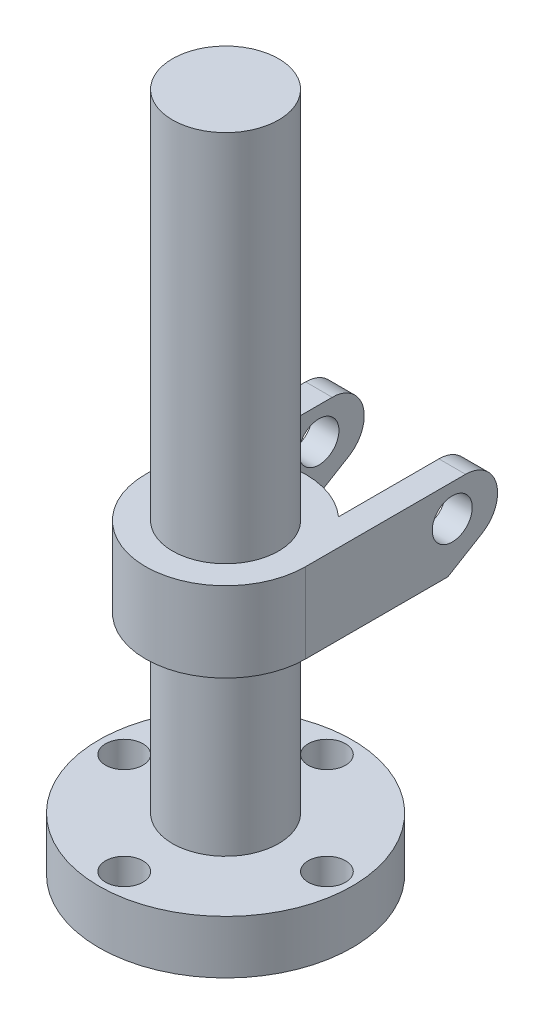
ISO-10303-21;
HEADER;
FILE_DESCRIPTION(('STEP AP214'),'2;1');
FILE_NAME('part.step','',(''),(''),'','','');
FILE_SCHEMA(('AUTOMOTIVE_DESIGN { 1 0 10303 214 1 1 1 1 }'));
ENDSEC;
DATA;
#1=APPLICATION_CONTEXT('core data for automotive mechanical design processes');
#2=APPLICATION_PROTOCOL_DEFINITION('international standard','automotive_design',2000,#1);
#3=PRODUCT_CONTEXT('',#1,'mechanical');
#4=PRODUCT('Part','Part','',(#3));
#5=PRODUCT_RELATED_PRODUCT_CATEGORY('part','',(#4));
#6=PRODUCT_DEFINITION_FORMATION('','',#4);
#7=PRODUCT_DEFINITION_CONTEXT('part definition',#1,'design');
#8=PRODUCT_DEFINITION('design','',#6,#7);
#9=PRODUCT_DEFINITION_SHAPE('','',#8);
#10=(LENGTH_UNIT() NAMED_UNIT(*) SI_UNIT(.MILLI.,.METRE.));
#11=(NAMED_UNIT(*) PLANE_ANGLE_UNIT() SI_UNIT($,.RADIAN.));
#12=(NAMED_UNIT(*) SI_UNIT($,.STERADIAN.) SOLID_ANGLE_UNIT());
#13=UNCERTAINTY_MEASURE_WITH_UNIT(LENGTH_MEASURE(1.E-05),#10,'distance_accuracy_value','');
#14=(GEOMETRIC_REPRESENTATION_CONTEXT(3) GLOBAL_UNCERTAINTY_ASSIGNED_CONTEXT((#13)) GLOBAL_UNIT_ASSIGNED_CONTEXT((#10,
#11,#12)) REPRESENTATION_CONTEXT('',''));
#15=CARTESIAN_POINT('',(0.,0.,0.));
#16=DIRECTION('',(0.,0.,1.));
#17=DIRECTION('',(1.,0.,0.));
#18=AXIS2_PLACEMENT_3D('',#15,#16,#17);
#19=CARTESIAN_POINT('',(0.,115.,0.));
#20=DIRECTION('',(0.,-1.,0.));
#21=DIRECTION('',(0.,0.,-1.));
#22=AXIS2_PLACEMENT_3D('',#19,#20,#21);
#23=CYLINDRICAL_SURFACE('',#22,30.);
#24=DIRECTION('',(0.,-1.,0.));
#25=VECTOR('',#24,1.);
#26=CARTESIAN_POINT('',(-20.,115.,-22.3606797749979));
#27=LINE('',#26,#25);
#28=CARTESIAN_POINT('',(-20.,115.,-22.3606797749979));
#29=VERTEX_POINT('',#28);
#30=CARTESIAN_POINT('',(-20.,85.,-22.3606797749979));
#31=VERTEX_POINT('',#30);
#32=EDGE_CURVE('E160',#29,#31,#27,.T.);
#33=ORIENTED_EDGE('',*,*,#32,.F.);
#34=CARTESIAN_POINT('',(0.,115.,0.));
#35=DIRECTION('',(0.,1.,0.));
#36=DIRECTION('',(0.,0.,1.));
#37=AXIS2_PLACEMENT_3D('',#34,#35,#36);
#38=CIRCLE('',#37,30.);
#39=CARTESIAN_POINT('',(20.,115.,-22.3606797749979));
#40=VERTEX_POINT('',#39);
#41=EDGE_CURVE('E70',#40,#29,#38,.T.);
#42=ORIENTED_EDGE('',*,*,#41,.F.);
#43=DIRECTION('',(0.,-1.,0.));
#44=VECTOR('',#43,1.);
#45=CARTESIAN_POINT('',(20.,115.,-22.3606797749979));
#46=LINE('',#45,#44);
#47=CARTESIAN_POINT('',(20.,85.,-22.3606797749979));
#48=VERTEX_POINT('',#47);
#49=EDGE_CURVE('E210',#48,#40,#46,.F.);
#50=ORIENTED_EDGE('',*,*,#49,.F.);
#51=CARTESIAN_POINT('',(0.,85.,0.));
#52=DIRECTION('',(0.,1.,0.));
#53=DIRECTION('',(0.,0.,1.));
#54=AXIS2_PLACEMENT_3D('',#51,#52,#53);
#55=CIRCLE('',#54,30.);
#56=EDGE_CURVE('E227',#48,#31,#55,.T.);
#57=ORIENTED_EDGE('',*,*,#56,.T.);
#58=EDGE_LOOP('',(#33,#42,#50,#57));
#59=FACE_BOUND('',#58,.T.);
#60=ADVANCED_FACE('F44',(#59),#23,.T.);
#61=DIRECTION('',(0.,-1.,0.));
#62=VECTOR('',#61,1.);
#63=CARTESIAN_POINT('',(-30.,115.,0.));
#64=LINE('',#63,#62);
#65=CARTESIAN_POINT('',(-30.,115.,0.));
#66=VERTEX_POINT('',#65);
#67=CARTESIAN_POINT('',(-30.,85.,0.));
#68=VERTEX_POINT('',#67);
#69=EDGE_CURVE('E62',#66,#68,#64,.T.);
#70=ORIENTED_EDGE('',*,*,#69,.T.);
#71=CARTESIAN_POINT('',(30.,85.,0.));
#72=VERTEX_POINT('',#71);
#73=EDGE_CURVE('E221',#68,#72,#55,.T.);
#74=ORIENTED_EDGE('',*,*,#73,.T.);
#75=DIRECTION('',(0.,-1.,0.));
#76=VECTOR('',#75,1.);
#77=CARTESIAN_POINT('',(30.,115.,0.));
#78=LINE('',#77,#76);
#79=CARTESIAN_POINT('',(30.,115.,0.));
#80=VERTEX_POINT('',#79);
#81=EDGE_CURVE('E168',#80,#72,#78,.T.);
#82=ORIENTED_EDGE('',*,*,#81,.F.);
#83=EDGE_CURVE('E226',#66,#80,#38,.T.);
#84=ORIENTED_EDGE('',*,*,#83,.F.);
#85=EDGE_LOOP('',(#70,#74,#82,#84));
#86=FACE_BOUND('',#85,.T.);
#87=ADVANCED_FACE('F310',(#86),#23,.T.);
#88=CARTESIAN_POINT('',(0.,20.,0.));
#89=DIRECTION('',(0.,-1.,0.));
#90=DIRECTION('',(0.,0.,-1.));
#91=AXIS2_PLACEMENT_3D('',#88,#89,#90);
#92=CYLINDRICAL_SURFACE('',#91,47.5);
#93=CARTESIAN_POINT('',(0.,20.,0.));
#94=DIRECTION('',(0.,1.,0.));
#95=DIRECTION('',(0.,0.,1.));
#96=AXIS2_PLACEMENT_3D('',#93,#94,#95);
#97=CIRCLE('',#96,47.5);
#98=CARTESIAN_POINT('',(0.,20.,47.5));
#99=VERTEX_POINT('',#98);
#100=EDGE_CURVE('E238',#99,#99,#97,.T.);
#101=ORIENTED_EDGE('',*,*,#100,.F.);
#102=EDGE_LOOP('',(#101));
#103=FACE_BOUND('',#102,.T.);
#104=CARTESIAN_POINT('',(0.,0.,0.));
#105=DIRECTION('',(0.,1.,0.));
#106=DIRECTION('',(0.,0.,1.));
#107=AXIS2_PLACEMENT_3D('',#104,#105,#106);
#108=CIRCLE('',#107,47.5);
#109=CARTESIAN_POINT('',(0.,0.,47.5));
#110=VERTEX_POINT('',#109);
#111=EDGE_CURVE('E234',#110,#110,#108,.T.);
#112=ORIENTED_EDGE('',*,*,#111,.T.);
#113=EDGE_LOOP('',(#112));
#114=FACE_BOUND('',#113,.T.);
#115=ADVANCED_FACE('F46',(#103,#114),#92,.T.);
#116=CARTESIAN_POINT('',(0.,20.,0.));
#117=DIRECTION('',(0.,1.,0.));
#118=DIRECTION('',(0.,0.,1.));
#119=AXIS2_PLACEMENT_3D('',#116,#117,#118);
#120=PLANE('',#119);
#121=CARTESIAN_POINT('',(0.,20.,-38.));
#122=DIRECTION('',(0.,1.,0.));
#123=DIRECTION('',(0.,0.,1.));
#124=AXIS2_PLACEMENT_3D('',#121,#122,#123);
#125=CIRCLE('',#124,7.);
#126=CARTESIAN_POINT('',(0.,20.,-31.));
#127=VERTEX_POINT('',#126);
#128=EDGE_CURVE('E681',#127,#127,#125,.T.);
#129=ORIENTED_EDGE('',*,*,#128,.F.);
#130=EDGE_LOOP('',(#129));
#131=FACE_BOUND('',#130,.T.);
#132=CARTESIAN_POINT('',(38.,20.,1.32676290876039E-13));
#133=DIRECTION('',(0.,1.,0.));
#134=DIRECTION('',(0.,0.,1.));
#135=AXIS2_PLACEMENT_3D('',#132,#133,#134);
#136=CIRCLE('',#135,7.);
#137=CARTESIAN_POINT('',(38.,20.,7.00000000000013));
#138=VERTEX_POINT('',#137);
#139=EDGE_CURVE('E685',#138,#138,#136,.T.);
#140=ORIENTED_EDGE('',*,*,#139,.F.);
#141=EDGE_LOOP('',(#140));
#142=FACE_BOUND('',#141,.T.);
#143=CARTESIAN_POINT('',(-2.65352581752078E-13,20.,38.));
#144=DIRECTION('',(0.,1.,0.));
#145=DIRECTION('',(0.,0.,1.));
#146=AXIS2_PLACEMENT_3D('',#143,#144,#145);
#147=CIRCLE('',#146,7.);
#148=CARTESIAN_POINT('',(-2.65352581752078E-13,20.,45.));
#149=VERTEX_POINT('',#148);
#150=EDGE_CURVE('E693',#149,#149,#147,.T.);
#151=ORIENTED_EDGE('',*,*,#150,.F.);
#152=EDGE_LOOP('',(#151));
#153=FACE_BOUND('',#152,.T.);
#154=CARTESIAN_POINT('',(-38.,20.,-3.98028872628117E-13));
#155=DIRECTION('',(0.,1.,0.));
#156=DIRECTION('',(0.,0.,1.));
#157=AXIS2_PLACEMENT_3D('',#154,#155,#156);
#158=CIRCLE('',#157,7.);
#159=CARTESIAN_POINT('',(-38.,20.,6.9999999999996));
#160=VERTEX_POINT('',#159);
#161=EDGE_CURVE('E265',#160,#160,#158,.T.);
#162=ORIENTED_EDGE('',*,*,#161,.F.);
#163=EDGE_LOOP('',(#162));
#164=FACE_BOUND('',#163,.T.);
#165=CARTESIAN_POINT('',(0.,20.,0.));
#166=DIRECTION('',(0.,1.,0.));
#167=DIRECTION('',(0.,0.,1.));
#168=AXIS2_PLACEMENT_3D('',#165,#166,#167);
#169=CIRCLE('',#168,19.9);
#170=CARTESIAN_POINT('',(0.,20.,19.9));
#171=VERTEX_POINT('',#170);
#172=EDGE_CURVE('E54',#171,#171,#169,.T.);
#173=ORIENTED_EDGE('',*,*,#172,.F.);
#174=EDGE_LOOP('',(#173));
#175=FACE_BOUND('',#174,.T.);
#176=ORIENTED_EDGE('',*,*,#100,.T.);
#177=EDGE_LOOP('',(#176));
#178=FACE_BOUND('',#177,.T.);
#179=ADVANCED_FACE('F357',(#131,#142,#153,#164,#175,#178),#120,.T.);
#180=CARTESIAN_POINT('',(0.,0.,0.));
#181=DIRECTION('',(0.,1.,0.));
#182=DIRECTION('',(0.,0.,1.));
#183=AXIS2_PLACEMENT_3D('',#180,#181,#182);
#184=PLANE('',#183);
#185=CARTESIAN_POINT('',(0.,0.,0.));
#186=DIRECTION('',(0.,-1.,0.));
#187=DIRECTION('',(0.,0.,-1.));
#188=AXIS2_PLACEMENT_3D('',#185,#186,#187);
#189=CIRCLE('',#188,20.);
#190=CARTESIAN_POINT('',(0.,0.,-20.));
#191=VERTEX_POINT('',#190);
#192=EDGE_CURVE('E369',#191,#191,#189,.T.);
#193=ORIENTED_EDGE('',*,*,#192,.F.);
#194=EDGE_LOOP('',(#193));
#195=FACE_BOUND('',#194,.T.);
#196=CARTESIAN_POINT('',(0.,0.,38.));
#197=DIRECTION('',(0.,-1.,0.));
#198=DIRECTION('',(0.,0.,-1.));
#199=AXIS2_PLACEMENT_3D('',#196,#197,#198);
#200=CIRCLE('',#199,5.);
#201=CARTESIAN_POINT('',(0.,0.,33.));
#202=VERTEX_POINT('',#201);
#203=EDGE_CURVE('E250',#202,#202,#200,.T.);
#204=ORIENTED_EDGE('',*,*,#203,.F.);
#205=EDGE_LOOP('',(#204));
#206=FACE_BOUND('',#205,.T.);
#207=CARTESIAN_POINT('',(38.,0.,-1.32676290876039E-13));
#208=DIRECTION('',(0.,-1.,0.));
#209=DIRECTION('',(0.,0.,-1.));
#210=AXIS2_PLACEMENT_3D('',#207,#208,#209);
#211=CIRCLE('',#210,5.);
#212=CARTESIAN_POINT('',(38.,0.,-5.00000000000013));
#213=VERTEX_POINT('',#212);
#214=EDGE_CURVE('E376',#213,#213,#211,.T.);
#215=ORIENTED_EDGE('',*,*,#214,.F.);
#216=EDGE_LOOP('',(#215));
#217=FACE_BOUND('',#216,.T.);
#218=CARTESIAN_POINT('',(-2.65352581752078E-13,0.,-38.));
#219=DIRECTION('',(0.,-1.,0.));
#220=DIRECTION('',(0.,0.,-1.));
#221=AXIS2_PLACEMENT_3D('',#218,#219,#220);
#222=CIRCLE('',#221,5.);
#223=CARTESIAN_POINT('',(-2.65352581752078E-13,0.,-43.));
#224=VERTEX_POINT('',#223);
#225=EDGE_CURVE('E380',#224,#224,#222,.T.);
#226=ORIENTED_EDGE('',*,*,#225,.F.);
#227=EDGE_LOOP('',(#226));
#228=FACE_BOUND('',#227,.T.);
#229=CARTESIAN_POINT('',(-38.,0.,3.98028872628117E-13));
#230=DIRECTION('',(0.,-1.,0.));
#231=DIRECTION('',(0.,0.,-1.));
#232=AXIS2_PLACEMENT_3D('',#229,#230,#231);
#233=CIRCLE('',#232,5.);
#234=CARTESIAN_POINT('',(-38.,0.,-4.9999999999996));
#235=VERTEX_POINT('',#234);
#236=EDGE_CURVE('E384',#235,#235,#233,.T.);
#237=ORIENTED_EDGE('',*,*,#236,.F.);
#238=EDGE_LOOP('',(#237));
#239=FACE_BOUND('',#238,.T.);
#240=ORIENTED_EDGE('',*,*,#111,.F.);
#241=EDGE_LOOP('',(#240));
#242=FACE_BOUND('',#241,.T.);
#243=ADVANCED_FACE('F355',(#195,#206,#217,#228,#239,#242),#184,.F.);
#244=CARTESIAN_POINT('',(0.,85.,0.));
#245=DIRECTION('',(0.,-1.,0.));
#246=DIRECTION('',(0.,0.,-1.));
#247=AXIS2_PLACEMENT_3D('',#244,#245,#246);
#248=CYLINDRICAL_SURFACE('',#247,19.9);
#249=CARTESIAN_POINT('',(0.,85.,0.));
#250=DIRECTION('',(0.,1.,0.));
#251=DIRECTION('',(0.,0.,1.));
#252=AXIS2_PLACEMENT_3D('',#249,#250,#251);
#253=CIRCLE('',#252,19.9);
#254=CARTESIAN_POINT('',(0.,85.,19.9));
#255=VERTEX_POINT('',#254);
#256=EDGE_CURVE('E225',#255,#255,#253,.T.);
#257=ORIENTED_EDGE('',*,*,#256,.F.);
#258=EDGE_LOOP('',(#257));
#259=FACE_BOUND('',#258,.T.);
#260=ORIENTED_EDGE('',*,*,#172,.T.);
#261=EDGE_LOOP('',(#260));
#262=FACE_BOUND('',#261,.T.);
#263=ADVANCED_FACE('F352',(#259,#262),#248,.T.);
#264=CARTESIAN_POINT('',(0.,115.,0.));
#265=DIRECTION('',(0.,1.,0.));
#266=DIRECTION('',(0.,0.,1.));
#267=AXIS2_PLACEMENT_3D('',#264,#265,#266);
#268=PLANE('',#267);
#269=ORIENTED_EDGE('',*,*,#41,.T.);
#270=DIRECTION('',(0.,0.,1.));
#271=VECTOR('',#270,1.);
#272=CARTESIAN_POINT('',(-20.,115.,0.));
#273=LINE('',#272,#271);
#274=CARTESIAN_POINT('',(-20.,115.,-60.));
#275=VERTEX_POINT('',#274);
#276=EDGE_CURVE('E125',#275,#29,#273,.T.);
#277=ORIENTED_EDGE('',*,*,#276,.F.);
#278=DIRECTION('',(-1.,0.,0.));
#279=VECTOR('',#278,1.);
#280=CARTESIAN_POINT('',(-20.,115.,-60.));
#281=LINE('',#280,#279);
#282=CARTESIAN_POINT('',(-30.,115.,-60.));
#283=VERTEX_POINT('',#282);
#284=EDGE_CURVE('E130',#275,#283,#281,.T.);
#285=ORIENTED_EDGE('',*,*,#284,.T.);
#286=DIRECTION('',(0.,0.,1.));
#287=VECTOR('',#286,1.);
#288=CARTESIAN_POINT('',(-30.,115.,-55.));
#289=LINE('',#288,#287);
#290=EDGE_CURVE('E288',#283,#66,#289,.T.);
#291=ORIENTED_EDGE('',*,*,#290,.T.);
#292=ORIENTED_EDGE('',*,*,#83,.T.);
#293=DIRECTION('',(0.,0.,1.));
#294=VECTOR('',#293,1.);
#295=CARTESIAN_POINT('',(30.,115.,0.));
#296=LINE('',#295,#294);
#297=CARTESIAN_POINT('',(30.,115.,-60.));
#298=VERTEX_POINT('',#297);
#299=EDGE_CURVE('E176',#298,#80,#296,.T.);
#300=ORIENTED_EDGE('',*,*,#299,.F.);
#301=DIRECTION('',(1.,0.,0.));
#302=VECTOR('',#301,1.);
#303=CARTESIAN_POINT('',(20.,115.,-60.));
#304=LINE('',#303,#302);
#305=CARTESIAN_POINT('',(20.,115.,-60.));
#306=VERTEX_POINT('',#305);
#307=EDGE_CURVE('E206',#306,#298,#304,.T.);
#308=ORIENTED_EDGE('',*,*,#307,.F.);
#309=DIRECTION('',(0.,0.,1.));
#310=VECTOR('',#309,1.);
#311=CARTESIAN_POINT('',(20.,115.,-55.));
#312=LINE('',#311,#310);
#313=EDGE_CURVE('E184',#306,#40,#312,.T.);
#314=ORIENTED_EDGE('',*,*,#313,.T.);
#315=EDGE_LOOP('',(#269,#277,#285,#291,#292,#300,#308,#314));
#316=FACE_BOUND('',#315,.T.);
#317=CARTESIAN_POINT('',(0.,115.,0.));
#318=DIRECTION('',(0.,1.,0.));
#319=DIRECTION('',(0.,0.,1.));
#320=AXIS2_PLACEMENT_3D('',#317,#318,#319);
#321=CIRCLE('',#320,19.9);
#322=CARTESIAN_POINT('',(0.,115.,19.9));
#323=VERTEX_POINT('',#322);
#324=EDGE_CURVE('E11',#323,#323,#321,.T.);
#325=ORIENTED_EDGE('',*,*,#324,.F.);
#326=EDGE_LOOP('',(#325));
#327=FACE_BOUND('',#326,.T.);
#328=ADVANCED_FACE('F127',(#316,#327),#268,.T.);
#329=CARTESIAN_POINT('',(0.,85.,0.));
#330=DIRECTION('',(0.,1.,0.));
#331=DIRECTION('',(0.,0.,1.));
#332=AXIS2_PLACEMENT_3D('',#329,#330,#331);
#333=PLANE('',#332);
#334=ORIENTED_EDGE('',*,*,#73,.F.);
#335=DIRECTION('',(0.,0.,-1.));
#336=VECTOR('',#335,1.);
#337=CARTESIAN_POINT('',(-30.,85.,0.));
#338=LINE('',#337,#336);
#339=CARTESIAN_POINT('',(-30.,85.,-53.3422176346147));
#340=VERTEX_POINT('',#339);
#341=EDGE_CURVE('E135',#68,#340,#338,.T.);
#342=ORIENTED_EDGE('',*,*,#341,.T.);
#343=DIRECTION('',(-1.,0.,0.));
#344=VECTOR('',#343,1.);
#345=CARTESIAN_POINT('',(-20.,85.,-53.3422176346147));
#346=LINE('',#345,#344);
#347=CARTESIAN_POINT('',(-20.,85.,-53.3422176346147));
#348=VERTEX_POINT('',#347);
#349=EDGE_CURVE('E155',#348,#340,#346,.T.);
#350=ORIENTED_EDGE('',*,*,#349,.F.);
#351=DIRECTION('',(0.,0.,-1.));
#352=VECTOR('',#351,1.);
#353=CARTESIAN_POINT('',(-20.,85.,0.));
#354=LINE('',#353,#352);
#355=EDGE_CURVE('E151',#31,#348,#354,.T.);
#356=ORIENTED_EDGE('',*,*,#355,.F.);
#357=ORIENTED_EDGE('',*,*,#56,.F.);
#358=DIRECTION('',(0.,0.,-1.));
#359=VECTOR('',#358,1.);
#360=CARTESIAN_POINT('',(20.,85.,0.));
#361=LINE('',#360,#359);
#362=CARTESIAN_POINT('',(20.,85.,-53.3422176346147));
#363=VERTEX_POINT('',#362);
#364=EDGE_CURVE('E172',#48,#363,#361,.T.);
#365=ORIENTED_EDGE('',*,*,#364,.T.);
#366=DIRECTION('',(1.,0.,0.));
#367=VECTOR('',#366,1.);
#368=CARTESIAN_POINT('',(20.,85.,-53.3422176346147));
#369=LINE('',#368,#367);
#370=CARTESIAN_POINT('',(30.,85.,-53.3422176346147));
#371=VERTEX_POINT('',#370);
#372=EDGE_CURVE('E187',#363,#371,#369,.T.);
#373=ORIENTED_EDGE('',*,*,#372,.T.);
#374=DIRECTION('',(0.,0.,-1.));
#375=VECTOR('',#374,1.);
#376=CARTESIAN_POINT('',(30.,85.,0.));
#377=LINE('',#376,#375);
#378=EDGE_CURVE('E191',#72,#371,#377,.T.);
#379=ORIENTED_EDGE('',*,*,#378,.F.);
#380=EDGE_LOOP('',(#334,#342,#350,#356,#357,#365,#373,#379));
#381=FACE_BOUND('',#380,.T.);
#382=ORIENTED_EDGE('',*,*,#256,.T.);
#383=EDGE_LOOP('',(#382));
#384=FACE_BOUND('',#383,.T.);
#385=ADVANCED_FACE('F315',(#381,#384),#333,.F.);
#386=CARTESIAN_POINT('',(0.,255.,0.));
#387=DIRECTION('',(0.,-1.,0.));
#388=DIRECTION('',(0.,0.,-1.));
#389=AXIS2_PLACEMENT_3D('',#386,#387,#388);
#390=CYLINDRICAL_SURFACE('',#389,19.9);
#391=CARTESIAN_POINT('',(0.,255.,0.));
#392=DIRECTION('',(0.,1.,0.));
#393=DIRECTION('',(0.,0.,1.));
#394=AXIS2_PLACEMENT_3D('',#391,#392,#393);
#395=CIRCLE('',#394,19.9);
#396=CARTESIAN_POINT('',(0.,255.,19.9));
#397=VERTEX_POINT('',#396);
#398=EDGE_CURVE('E218',#397,#397,#395,.T.);
#399=ORIENTED_EDGE('',*,*,#398,.F.);
#400=EDGE_LOOP('',(#399));
#401=FACE_BOUND('',#400,.T.);
#402=ORIENTED_EDGE('',*,*,#324,.T.);
#403=EDGE_LOOP('',(#402));
#404=FACE_BOUND('',#403,.T.);
#405=ADVANCED_FACE('F404',(#401,#404),#390,.T.);
#406=CARTESIAN_POINT('',(0.,255.,0.));
#407=DIRECTION('',(0.,1.,0.));
#408=DIRECTION('',(0.,0.,1.));
#409=AXIS2_PLACEMENT_3D('',#406,#407,#408);
#410=PLANE('',#409);
#411=ORIENTED_EDGE('',*,*,#398,.T.);
#412=EDGE_LOOP('',(#411));
#413=FACE_BOUND('',#412,.T.);
#414=ADVANCED_FACE('F408',(#413),#410,.T.);
#415=CARTESIAN_POINT('',(20.,103.,-60.));
#416=DIRECTION('',(1.,0.,0.));
#417=DIRECTION('',(0.,0.,-1.));
#418=AXIS2_PLACEMENT_3D('',#415,#416,#417);
#419=PLANE('',#418);
#420=CARTESIAN_POINT('',(20.,103.,-55.));
#421=DIRECTION('',(1.,0.,0.));
#422=DIRECTION('',(0.,0.,-1.));
#423=AXIS2_PLACEMENT_3D('',#420,#421,#422);
#424=CIRCLE('',#423,7.5);
#425=CARTESIAN_POINT('',(20.,103.,-62.5));
#426=VERTEX_POINT('',#425);
#427=EDGE_CURVE('E164',#426,#426,#424,.T.);
#428=ORIENTED_EDGE('',*,*,#427,.T.);
#429=EDGE_LOOP('',(#428));
#430=FACE_BOUND('',#429,.T.);
#431=ORIENTED_EDGE('',*,*,#364,.F.);
#432=ORIENTED_EDGE('',*,*,#49,.T.);
#433=ORIENTED_EDGE('',*,*,#313,.F.);
#434=CARTESIAN_POINT('',(20.,103.,-60.));
#435=DIRECTION('',(1.,0.,0.));
#436=DIRECTION('',(0.,0.,-1.));
#437=AXIS2_PLACEMENT_3D('',#434,#435,#436);
#438=CIRCLE('',#437,12.);
#439=CARTESIAN_POINT('',(20.,92.7139923915746,-66.1804568989206));
#440=VERTEX_POINT('',#439);
#441=EDGE_CURVE('E180',#440,#306,#438,.T.);
#442=ORIENTED_EDGE('',*,*,#441,.F.);
#443=DIRECTION('',(0.,0.515038074910048,-0.857167300702116));
#444=VECTOR('',#443,1.);
#445=CARTESIAN_POINT('',(20.,92.7139923915746,-66.1804568989206));
#446=LINE('',#445,#444);
#447=EDGE_CURVE('E175',#363,#440,#446,.T.);
#448=ORIENTED_EDGE('',*,*,#447,.F.);
#449=EDGE_LOOP('',(#431,#432,#433,#442,#448));
#450=FACE_BOUND('',#449,.T.);
#451=ADVANCED_FACE('F329',(#430,#450),#419,.F.);
#452=CARTESIAN_POINT('',(20.,103.,-60.));
#453=DIRECTION('',(1.,0.,0.));
#454=DIRECTION('',(0.,0.,-1.));
#455=AXIS2_PLACEMENT_3D('',#452,#453,#454);
#456=CYLINDRICAL_SURFACE('',#455,12.);
#457=CARTESIAN_POINT('',(30.,103.,-60.));
#458=DIRECTION('',(1.,0.,0.));
#459=DIRECTION('',(0.,0.,-1.));
#460=AXIS2_PLACEMENT_3D('',#457,#458,#459);
#461=CIRCLE('',#460,12.);
#462=CARTESIAN_POINT('',(30.,92.7139923915746,-66.1804568989206));
#463=VERTEX_POINT('',#462);
#464=EDGE_CURVE('E199',#463,#298,#461,.T.);
#465=ORIENTED_EDGE('',*,*,#464,.F.);
#466=DIRECTION('',(1.,0.,0.));
#467=VECTOR('',#466,1.);
#468=CARTESIAN_POINT('',(20.,92.7139923915746,-66.1804568989206));
#469=LINE('',#468,#467);
#470=EDGE_CURVE('E211',#440,#463,#469,.T.);
#471=ORIENTED_EDGE('',*,*,#470,.F.);
#472=ORIENTED_EDGE('',*,*,#441,.T.);
#473=ORIENTED_EDGE('',*,*,#307,.T.);
#474=EDGE_LOOP('',(#465,#471,#472,#473));
#475=FACE_BOUND('',#474,.T.);
#476=ADVANCED_FACE('F324',(#475),#456,.T.);
#477=CARTESIAN_POINT('',(20.,92.7139923915746,-66.1804568989206));
#478=DIRECTION('',(0.,-0.857167300702116,-0.515038074910048));
#479=DIRECTION('',(0.,0.515038074910048,-0.857167300702116));
#480=AXIS2_PLACEMENT_3D('',#477,#478,#479);
#481=PLANE('',#480);
#482=DIRECTION('',(0.,0.515038074910048,-0.857167300702116));
#483=VECTOR('',#482,1.);
#484=CARTESIAN_POINT('',(30.,92.7139923915746,-66.1804568989206));
#485=LINE('',#484,#483);
#486=EDGE_CURVE('E195',#371,#463,#485,.T.);
#487=ORIENTED_EDGE('',*,*,#486,.F.);
#488=ORIENTED_EDGE('',*,*,#372,.F.);
#489=ORIENTED_EDGE('',*,*,#447,.T.);
#490=ORIENTED_EDGE('',*,*,#470,.T.);
#491=EDGE_LOOP('',(#487,#488,#489,#490));
#492=FACE_BOUND('',#491,.T.);
#493=ADVANCED_FACE('F331',(#492),#481,.T.);
#494=CARTESIAN_POINT('',(30.,103.,-60.));
#495=DIRECTION('',(1.,0.,0.));
#496=DIRECTION('',(0.,0.,-1.));
#497=AXIS2_PLACEMENT_3D('',#494,#495,#496);
#498=PLANE('',#497);
#499=CARTESIAN_POINT('',(30.,103.,-55.));
#500=DIRECTION('',(1.,0.,0.));
#501=DIRECTION('',(0.,0.,-1.));
#502=AXIS2_PLACEMENT_3D('',#499,#500,#501);
#503=CIRCLE('',#502,7.5);
#504=CARTESIAN_POINT('',(30.,103.,-62.5));
#505=VERTEX_POINT('',#504);
#506=EDGE_CURVE('E163',#505,#505,#503,.T.);
#507=ORIENTED_EDGE('',*,*,#506,.F.);
#508=EDGE_LOOP('',(#507));
#509=FACE_BOUND('',#508,.T.);
#510=ORIENTED_EDGE('',*,*,#81,.T.);
#511=ORIENTED_EDGE('',*,*,#378,.T.);
#512=ORIENTED_EDGE('',*,*,#486,.T.);
#513=ORIENTED_EDGE('',*,*,#464,.T.);
#514=ORIENTED_EDGE('',*,*,#299,.T.);
#515=EDGE_LOOP('',(#510,#511,#512,#513,#514));
#516=FACE_BOUND('',#515,.T.);
#517=ADVANCED_FACE('F320',(#509,#516),#498,.T.);
#518=CARTESIAN_POINT('',(20.,103.,-55.));
#519=DIRECTION('',(1.,0.,0.));
#520=DIRECTION('',(0.,0.,-1.));
#521=AXIS2_PLACEMENT_3D('',#518,#519,#520);
#522=CYLINDRICAL_SURFACE('',#521,7.5);
#523=ORIENTED_EDGE('',*,*,#427,.F.);
#524=EDGE_LOOP('',(#523));
#525=FACE_BOUND('',#524,.T.);
#526=ORIENTED_EDGE('',*,*,#506,.T.);
#527=EDGE_LOOP('',(#526));
#528=FACE_BOUND('',#527,.T.);
#529=ADVANCED_FACE('F338',(#525,#528),#522,.F.);
#530=CARTESIAN_POINT('',(-20.,103.,-60.));
#531=DIRECTION('',(-1.,0.,0.));
#532=DIRECTION('',(0.,0.,-1.));
#533=AXIS2_PLACEMENT_3D('',#530,#531,#532);
#534=PLANE('',#533);
#535=CARTESIAN_POINT('',(-20.,103.,-55.));
#536=DIRECTION('',(1.,0.,0.));
#537=DIRECTION('',(0.,0.,-1.));
#538=AXIS2_PLACEMENT_3D('',#535,#536,#537);
#539=CIRCLE('',#538,7.5);
#540=CARTESIAN_POINT('',(-20.,103.,-62.5));
#541=VERTEX_POINT('',#540);
#542=EDGE_CURVE('E275',#541,#541,#539,.T.);
#543=ORIENTED_EDGE('',*,*,#542,.F.);
#544=EDGE_LOOP('',(#543));
#545=FACE_BOUND('',#544,.T.);
#546=ORIENTED_EDGE('',*,*,#276,.T.);
#547=ORIENTED_EDGE('',*,*,#32,.T.);
#548=ORIENTED_EDGE('',*,*,#355,.T.);
#549=DIRECTION('',(0.,0.515038074910048,-0.857167300702116));
#550=VECTOR('',#549,1.);
#551=CARTESIAN_POINT('',(-20.,92.7139923915746,-66.1804568989206));
#552=LINE('',#551,#550);
#553=CARTESIAN_POINT('',(-20.,92.7139923915746,-66.1804568989206));
#554=VERTEX_POINT('',#553);
#555=EDGE_CURVE('E140',#348,#554,#552,.T.);
#556=ORIENTED_EDGE('',*,*,#555,.T.);
#557=CARTESIAN_POINT('',(-20.,103.,-60.));
#558=DIRECTION('',(1.,0.,0.));
#559=DIRECTION('',(0.,0.,-1.));
#560=AXIS2_PLACEMENT_3D('',#557,#558,#559);
#561=CIRCLE('',#560,12.);
#562=EDGE_CURVE('E134',#554,#275,#561,.T.);
#563=ORIENTED_EDGE('',*,*,#562,.T.);
#564=EDGE_LOOP('',(#546,#547,#548,#556,#563));
#565=FACE_BOUND('',#564,.T.);
#566=ADVANCED_FACE('F138',(#545,#565),#534,.F.);
#567=CARTESIAN_POINT('',(-30.,103.,-60.));
#568=DIRECTION('',(-1.,0.,0.));
#569=DIRECTION('',(0.,0.,-1.));
#570=AXIS2_PLACEMENT_3D('',#567,#568,#569);
#571=PLANE('',#570);
#572=ORIENTED_EDGE('',*,*,#69,.F.);
#573=ORIENTED_EDGE('',*,*,#290,.F.);
#574=CARTESIAN_POINT('',(-30.,103.,-60.));
#575=DIRECTION('',(1.,0.,0.));
#576=DIRECTION('',(0.,0.,-1.));
#577=AXIS2_PLACEMENT_3D('',#574,#575,#576);
#578=CIRCLE('',#577,12.);
#579=CARTESIAN_POINT('',(-30.,92.7139923915746,-66.1804568989206));
#580=VERTEX_POINT('',#579);
#581=EDGE_CURVE('E148',#580,#283,#578,.T.);
#582=ORIENTED_EDGE('',*,*,#581,.F.);
#583=DIRECTION('',(0.,0.515038074910048,-0.857167300702116));
#584=VECTOR('',#583,1.);
#585=CARTESIAN_POINT('',(-30.,92.7139923915746,-66.1804568989206));
#586=LINE('',#585,#584);
#587=EDGE_CURVE('E293',#340,#580,#586,.T.);
#588=ORIENTED_EDGE('',*,*,#587,.F.);
#589=ORIENTED_EDGE('',*,*,#341,.F.);
#590=EDGE_LOOP('',(#572,#573,#582,#588,#589));
#591=FACE_BOUND('',#590,.T.);
#592=CARTESIAN_POINT('',(-30.,103.,-55.));
#593=DIRECTION('',(1.,0.,0.));
#594=DIRECTION('',(0.,0.,-1.));
#595=AXIS2_PLACEMENT_3D('',#592,#593,#594);
#596=CIRCLE('',#595,7.5);
#597=CARTESIAN_POINT('',(-30.,103.,-62.5));
#598=VERTEX_POINT('',#597);
#599=EDGE_CURVE('E279',#598,#598,#596,.T.);
#600=ORIENTED_EDGE('',*,*,#599,.T.);
#601=EDGE_LOOP('',(#600));
#602=FACE_BOUND('',#601,.T.);
#603=ADVANCED_FACE('F305',(#591,#602),#571,.T.);
#604=CARTESIAN_POINT('',(-20.,92.7139923915746,-66.1804568989206));
#605=DIRECTION('',(0.,0.857167300702116,0.515038074910048));
#606=DIRECTION('',(0.,-0.515038074910048,0.857167300702116));
#607=AXIS2_PLACEMENT_3D('',#604,#605,#606);
#608=PLANE('',#607);
#609=ORIENTED_EDGE('',*,*,#587,.T.);
#610=DIRECTION('',(-1.,0.,0.));
#611=VECTOR('',#610,1.);
#612=CARTESIAN_POINT('',(-20.,92.7139923915746,-66.1804568989206));
#613=LINE('',#612,#611);
#614=EDGE_CURVE('E150',#554,#580,#613,.T.);
#615=ORIENTED_EDGE('',*,*,#614,.F.);
#616=ORIENTED_EDGE('',*,*,#555,.F.);
#617=ORIENTED_EDGE('',*,*,#349,.T.);
#618=EDGE_LOOP('',(#609,#615,#616,#617));
#619=FACE_BOUND('',#618,.T.);
#620=ADVANCED_FACE('F302',(#619),#608,.F.);
#621=CARTESIAN_POINT('',(-20.,103.,-60.));
#622=DIRECTION('',(-1.,0.,0.));
#623=DIRECTION('',(0.,0.,1.));
#624=AXIS2_PLACEMENT_3D('',#621,#622,#623);
#625=CYLINDRICAL_SURFACE('',#624,12.);
#626=ORIENTED_EDGE('',*,*,#581,.T.);
#627=ORIENTED_EDGE('',*,*,#284,.F.);
#628=ORIENTED_EDGE('',*,*,#562,.F.);
#629=ORIENTED_EDGE('',*,*,#614,.T.);
#630=EDGE_LOOP('',(#626,#627,#628,#629));
#631=FACE_BOUND('',#630,.T.);
#632=ADVANCED_FACE('F146',(#631),#625,.T.);
#633=CARTESIAN_POINT('',(-20.,103.,-55.));
#634=DIRECTION('',(-1.,0.,0.));
#635=DIRECTION('',(0.,0.,1.));
#636=AXIS2_PLACEMENT_3D('',#633,#634,#635);
#637=CYLINDRICAL_SURFACE('',#636,7.5);
#638=ORIENTED_EDGE('',*,*,#542,.T.);
#639=EDGE_LOOP('',(#638));
#640=FACE_BOUND('',#639,.T.);
#641=ORIENTED_EDGE('',*,*,#599,.F.);
#642=EDGE_LOOP('',(#641));
#643=FACE_BOUND('',#642,.T.);
#644=ADVANCED_FACE('F514',(#640,#643),#637,.F.);
#645=CARTESIAN_POINT('',(-38.,10.,-3.98028872628117E-13));
#646=DIRECTION('',(0.,1.,0.));
#647=DIRECTION('',(0.,0.,1.));
#648=AXIS2_PLACEMENT_3D('',#645,#646,#647);
#649=CYLINDRICAL_SURFACE('',#648,7.);
#650=CARTESIAN_POINT('',(-38.,10.,-3.98028872628117E-13));
#651=DIRECTION('',(0.,1.,0.));
#652=DIRECTION('',(0.,0.,1.));
#653=AXIS2_PLACEMENT_3D('',#650,#651,#652);
#654=CIRCLE('',#653,7.);
#655=CARTESIAN_POINT('',(-38.,10.,6.9999999999996));
#656=VERTEX_POINT('',#655);
#657=EDGE_CURVE('E260',#656,#656,#654,.T.);
#658=ORIENTED_EDGE('',*,*,#657,.F.);
#659=EDGE_LOOP('',(#658));
#660=FACE_BOUND('',#659,.T.);
#661=ORIENTED_EDGE('',*,*,#161,.T.);
#662=EDGE_LOOP('',(#661));
#663=FACE_BOUND('',#662,.T.);
#664=ADVANCED_FACE('F523',(#660,#663),#649,.F.);
#665=CARTESIAN_POINT('',(-38.,10.,-3.98028872628117E-13));
#666=DIRECTION('',(0.,1.,0.));
#667=DIRECTION('',(0.,0.,1.));
#668=AXIS2_PLACEMENT_3D('',#665,#666,#667);
#669=PLANE('',#668);
#670=CARTESIAN_POINT('',(-38.,10.,3.98028872628117E-13));
#671=DIRECTION('',(0.,1.,0.));
#672=DIRECTION('',(0.,0.,1.));
#673=AXIS2_PLACEMENT_3D('',#670,#671,#672);
#674=CIRCLE('',#673,5.);
#675=CARTESIAN_POINT('',(-38.,10.,5.0000000000004));
#676=VERTEX_POINT('',#675);
#677=EDGE_CURVE('E48',#676,#676,#674,.T.);
#678=ORIENTED_EDGE('',*,*,#677,.F.);
#679=EDGE_LOOP('',(#678));
#680=FACE_BOUND('',#679,.T.);
#681=ORIENTED_EDGE('',*,*,#657,.T.);
#682=EDGE_LOOP('',(#681));
#683=FACE_BOUND('',#682,.T.);
#684=ADVANCED_FACE('F533',(#680,#683),#669,.T.);
#685=CARTESIAN_POINT('',(-2.65352581752078E-13,10.,38.));
#686=DIRECTION('',(0.,1.,0.));
#687=DIRECTION('',(0.,0.,1.));
#688=AXIS2_PLACEMENT_3D('',#685,#686,#687);
#689=CYLINDRICAL_SURFACE('',#688,7.);
#690=CARTESIAN_POINT('',(-2.65352581752078E-13,10.,38.));
#691=DIRECTION('',(0.,1.,0.));
#692=DIRECTION('',(0.,0.,1.));
#693=AXIS2_PLACEMENT_3D('',#690,#691,#692);
#694=CIRCLE('',#693,7.);
#695=CARTESIAN_POINT('',(-2.65352581752078E-13,10.,45.));
#696=VERTEX_POINT('',#695);
#697=EDGE_CURVE('E271',#696,#696,#694,.T.);
#698=ORIENTED_EDGE('',*,*,#697,.F.);
#699=EDGE_LOOP('',(#698));
#700=FACE_BOUND('',#699,.T.);
#701=ORIENTED_EDGE('',*,*,#150,.T.);
#702=EDGE_LOOP('',(#701));
#703=FACE_BOUND('',#702,.T.);
#704=ADVANCED_FACE('F544',(#700,#703),#689,.F.);
#705=CARTESIAN_POINT('',(-2.65352581752078E-13,10.,38.));
#706=DIRECTION('',(0.,1.,0.));
#707=DIRECTION('',(0.,0.,1.));
#708=AXIS2_PLACEMENT_3D('',#705,#706,#707);
#709=PLANE('',#708);
#710=CARTESIAN_POINT('',(0.,10.,38.));
#711=DIRECTION('',(0.,1.,0.));
#712=DIRECTION('',(0.,0.,1.));
#713=AXIS2_PLACEMENT_3D('',#710,#711,#712);
#714=CIRCLE('',#713,5.);
#715=CARTESIAN_POINT('',(0.,10.,43.));
#716=VERTEX_POINT('',#715);
#717=EDGE_CURVE('E253',#716,#716,#714,.T.);
#718=ORIENTED_EDGE('',*,*,#717,.F.);
#719=EDGE_LOOP('',(#718));
#720=FACE_BOUND('',#719,.T.);
#721=ORIENTED_EDGE('',*,*,#697,.T.);
#722=EDGE_LOOP('',(#721));
#723=FACE_BOUND('',#722,.T.);
#724=ADVANCED_FACE('F555',(#720,#723),#709,.T.);
#725=CARTESIAN_POINT('',(38.,10.,1.32676290876039E-13));
#726=DIRECTION('',(0.,1.,0.));
#727=DIRECTION('',(0.,0.,1.));
#728=AXIS2_PLACEMENT_3D('',#725,#726,#727);
#729=CYLINDRICAL_SURFACE('',#728,7.);
#730=CARTESIAN_POINT('',(38.,10.,1.32676290876039E-13));
#731=DIRECTION('',(0.,1.,0.));
#732=DIRECTION('',(0.,0.,1.));
#733=AXIS2_PLACEMENT_3D('',#730,#731,#732);
#734=CIRCLE('',#733,7.);
#735=CARTESIAN_POINT('',(38.,10.,7.00000000000013));
#736=VERTEX_POINT('',#735);
#737=EDGE_CURVE('E689',#736,#736,#734,.T.);
#738=ORIENTED_EDGE('',*,*,#737,.F.);
#739=EDGE_LOOP('',(#738));
#740=FACE_BOUND('',#739,.T.);
#741=ORIENTED_EDGE('',*,*,#139,.T.);
#742=EDGE_LOOP('',(#741));
#743=FACE_BOUND('',#742,.T.);
#744=ADVANCED_FACE('F565',(#740,#743),#729,.F.);
#745=CARTESIAN_POINT('',(38.,10.,1.32676290876039E-13));
#746=DIRECTION('',(0.,1.,0.));
#747=DIRECTION('',(0.,0.,1.));
#748=AXIS2_PLACEMENT_3D('',#745,#746,#747);
#749=PLANE('',#748);
#750=CARTESIAN_POINT('',(38.,10.,-1.32676290876039E-13));
#751=DIRECTION('',(0.,1.,0.));
#752=DIRECTION('',(0.,0.,1.));
#753=AXIS2_PLACEMENT_3D('',#750,#751,#752);
#754=CIRCLE('',#753,5.);
#755=CARTESIAN_POINT('',(38.,10.,4.99999999999987));
#756=VERTEX_POINT('',#755);
#757=EDGE_CURVE('E249',#756,#756,#754,.T.);
#758=ORIENTED_EDGE('',*,*,#757,.F.);
#759=EDGE_LOOP('',(#758));
#760=FACE_BOUND('',#759,.T.);
#761=ORIENTED_EDGE('',*,*,#737,.T.);
#762=EDGE_LOOP('',(#761));
#763=FACE_BOUND('',#762,.T.);
#764=ADVANCED_FACE('F575',(#760,#763),#749,.T.);
#765=CARTESIAN_POINT('',(0.,10.,-38.));
#766=DIRECTION('',(0.,1.,0.));
#767=DIRECTION('',(0.,0.,1.));
#768=AXIS2_PLACEMENT_3D('',#765,#766,#767);
#769=CYLINDRICAL_SURFACE('',#768,7.);
#770=CARTESIAN_POINT('',(0.,10.,-38.));
#771=DIRECTION('',(0.,1.,0.));
#772=DIRECTION('',(0.,0.,1.));
#773=AXIS2_PLACEMENT_3D('',#770,#771,#772);
#774=CIRCLE('',#773,7.);
#775=CARTESIAN_POINT('',(0.,10.,-31.));
#776=VERTEX_POINT('',#775);
#777=EDGE_CURVE('E282',#776,#776,#774,.T.);
#778=ORIENTED_EDGE('',*,*,#777,.F.);
#779=EDGE_LOOP('',(#778));
#780=FACE_BOUND('',#779,.T.);
#781=ORIENTED_EDGE('',*,*,#128,.T.);
#782=EDGE_LOOP('',(#781));
#783=FACE_BOUND('',#782,.T.);
#784=ADVANCED_FACE('F584',(#780,#783),#769,.F.);
#785=CARTESIAN_POINT('',(0.,10.,-38.));
#786=DIRECTION('',(0.,1.,0.));
#787=DIRECTION('',(0.,0.,1.));
#788=AXIS2_PLACEMENT_3D('',#785,#786,#787);
#789=PLANE('',#788);
#790=CARTESIAN_POINT('',(-2.65352581752078E-13,10.,-38.));
#791=DIRECTION('',(0.,1.,0.));
#792=DIRECTION('',(0.,0.,1.));
#793=AXIS2_PLACEMENT_3D('',#790,#791,#792);
#794=CIRCLE('',#793,5.);
#795=CARTESIAN_POINT('',(-2.65352581752078E-13,10.,-33.));
#796=VERTEX_POINT('',#795);
#797=EDGE_CURVE('E245',#796,#796,#794,.T.);
#798=ORIENTED_EDGE('',*,*,#797,.F.);
#799=EDGE_LOOP('',(#798));
#800=FACE_BOUND('',#799,.T.);
#801=ORIENTED_EDGE('',*,*,#777,.T.);
#802=EDGE_LOOP('',(#801));
#803=FACE_BOUND('',#802,.T.);
#804=ADVANCED_FACE('F594',(#800,#803),#789,.T.);
#805=CARTESIAN_POINT('',(-2.65352581752078E-13,23.,-38.));
#806=DIRECTION('',(0.,-1.,0.));
#807=DIRECTION('',(0.,0.,-1.));
#808=AXIS2_PLACEMENT_3D('',#805,#806,#807);
#809=CYLINDRICAL_SURFACE('',#808,5.);
#810=ORIENTED_EDGE('',*,*,#797,.T.);
#811=EDGE_LOOP('',(#810));
#812=FACE_BOUND('',#811,.T.);
#813=ORIENTED_EDGE('',*,*,#225,.T.);
#814=EDGE_LOOP('',(#813));
#815=FACE_BOUND('',#814,.T.);
#816=ADVANCED_FACE('F603',(#812,#815),#809,.F.);
#817=CARTESIAN_POINT('',(38.,23.,-1.32676290876039E-13));
#818=DIRECTION('',(0.,-1.,0.));
#819=DIRECTION('',(0.,0.,-1.));
#820=AXIS2_PLACEMENT_3D('',#817,#818,#819);
#821=CYLINDRICAL_SURFACE('',#820,5.);
#822=ORIENTED_EDGE('',*,*,#757,.T.);
#823=EDGE_LOOP('',(#822));
#824=FACE_BOUND('',#823,.T.);
#825=ORIENTED_EDGE('',*,*,#214,.T.);
#826=EDGE_LOOP('',(#825));
#827=FACE_BOUND('',#826,.T.);
#828=ADVANCED_FACE('F613',(#824,#827),#821,.F.);
#829=CARTESIAN_POINT('',(0.,23.,38.));
#830=DIRECTION('',(0.,-1.,0.));
#831=DIRECTION('',(0.,0.,-1.));
#832=AXIS2_PLACEMENT_3D('',#829,#830,#831);
#833=CYLINDRICAL_SURFACE('',#832,5.);
#834=ORIENTED_EDGE('',*,*,#717,.T.);
#835=EDGE_LOOP('',(#834));
#836=FACE_BOUND('',#835,.T.);
#837=ORIENTED_EDGE('',*,*,#203,.T.);
#838=EDGE_LOOP('',(#837));
#839=FACE_BOUND('',#838,.T.);
#840=ADVANCED_FACE('F623',(#836,#839),#833,.F.);
#841=CARTESIAN_POINT('',(-38.,23.,3.98028872628117E-13));
#842=DIRECTION('',(0.,-1.,0.));
#843=DIRECTION('',(0.,0.,-1.));
#844=AXIS2_PLACEMENT_3D('',#841,#842,#843);
#845=CYLINDRICAL_SURFACE('',#844,5.);
#846=ORIENTED_EDGE('',*,*,#677,.T.);
#847=EDGE_LOOP('',(#846));
#848=FACE_BOUND('',#847,.T.);
#849=ORIENTED_EDGE('',*,*,#236,.T.);
#850=EDGE_LOOP('',(#849));
#851=FACE_BOUND('',#850,.T.);
#852=ADVANCED_FACE('F633',(#848,#851),#845,.F.);
#853=CARTESIAN_POINT('',(0.,15.,0.));
#854=DIRECTION('',(0.,-1.,0.));
#855=DIRECTION('',(0.,0.,-1.));
#856=AXIS2_PLACEMENT_3D('',#853,#854,#855);
#857=CYLINDRICAL_SURFACE('',#856,20.);
#858=CARTESIAN_POINT('',(0.,15.,0.));
#859=DIRECTION('',(0.,-1.,0.));
#860=DIRECTION('',(0.,0.,-1.));
#861=AXIS2_PLACEMENT_3D('',#858,#859,#860);
#862=CIRCLE('',#861,20.);
#863=CARTESIAN_POINT('',(0.,15.,-20.));
#864=VERTEX_POINT('',#863);
#865=EDGE_CURVE('E664',#864,#864,#862,.T.);
#866=ORIENTED_EDGE('',*,*,#865,.F.);
#867=EDGE_LOOP('',(#866));
#868=FACE_BOUND('',#867,.T.);
#869=ORIENTED_EDGE('',*,*,#192,.T.);
#870=EDGE_LOOP('',(#869));
#871=FACE_BOUND('',#870,.T.);
#872=ADVANCED_FACE('F641',(#868,#871),#857,.F.);
#873=CARTESIAN_POINT('',(0.,15.,0.));
#874=DIRECTION('',(0.,-1.,0.));
#875=DIRECTION('',(0.,0.,-1.));
#876=AXIS2_PLACEMENT_3D('',#873,#874,#875);
#877=PLANE('',#876);
#878=ORIENTED_EDGE('',*,*,#865,.T.);
#879=EDGE_LOOP('',(#878));
#880=FACE_BOUND('',#879,.T.);
#881=ADVANCED_FACE('F649',(#880),#877,.T.);
#882=CLOSED_SHELL('',(#60,#87,#115,#179,#243,#263,#328,#385,#405,#414,#451,#476,#493,#517,#529,
#566,#603,#620,#632,#644,#664,#684,#704,#724,#744,#764,#784,#804,#816,#828,#840,#852,#872,#881));
#883=MANIFOLD_SOLID_BREP('B2',#882);
#884=ADVANCED_BREP_SHAPE_REPRESENTATION('',(#18,#883),#14);
#885=SHAPE_DEFINITION_REPRESENTATION(#9,#884);
ENDSEC;
END-ISO-10303-21;
